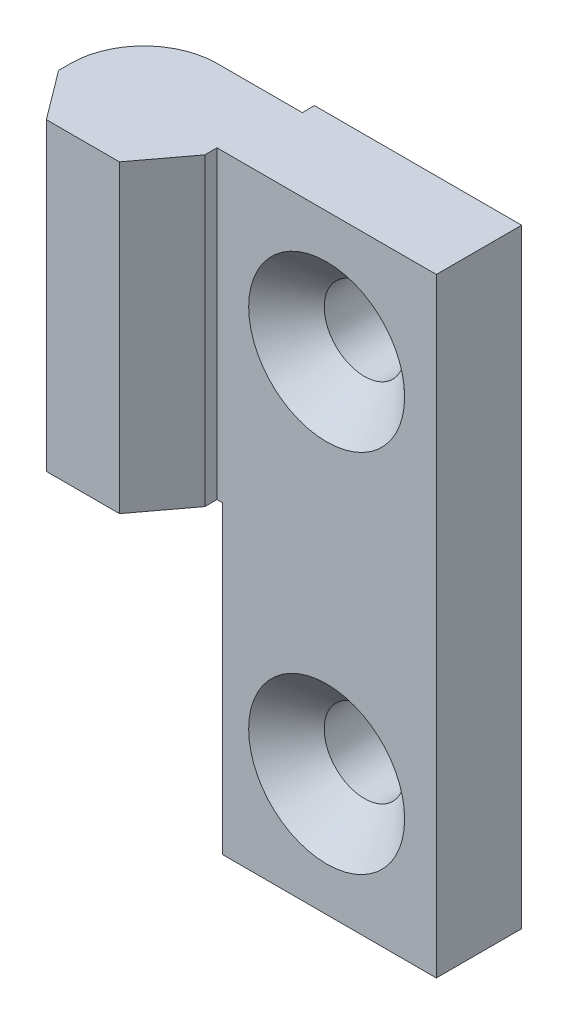
ISO-10303-21;
HEADER;
FILE_DESCRIPTION(('STEP AP214'),'2;1');
FILE_NAME('part.step','',(''),(''),'','','');
FILE_SCHEMA(('AUTOMOTIVE_DESIGN { 1 0 10303 214 1 1 1 1 }'));
ENDSEC;
DATA;
#1=APPLICATION_CONTEXT('core data for automotive mechanical design processes');
#2=APPLICATION_PROTOCOL_DEFINITION('international standard','automotive_design',2000,#1);
#3=PRODUCT_CONTEXT('',#1,'mechanical');
#4=PRODUCT('Part','Part','',(#3));
#5=PRODUCT_RELATED_PRODUCT_CATEGORY('part','',(#4));
#6=PRODUCT_DEFINITION_FORMATION('','',#4);
#7=PRODUCT_DEFINITION_CONTEXT('part definition',#1,'design');
#8=PRODUCT_DEFINITION('design','',#6,#7);
#9=PRODUCT_DEFINITION_SHAPE('','',#8);
#10=(LENGTH_UNIT() NAMED_UNIT(*) SI_UNIT(.MILLI.,.METRE.));
#11=(NAMED_UNIT(*) PLANE_ANGLE_UNIT() SI_UNIT($,.RADIAN.));
#12=(NAMED_UNIT(*) SI_UNIT($,.STERADIAN.) SOLID_ANGLE_UNIT());
#13=UNCERTAINTY_MEASURE_WITH_UNIT(LENGTH_MEASURE(1.E-05),#10,'distance_accuracy_value','');
#14=(GEOMETRIC_REPRESENTATION_CONTEXT(3) GLOBAL_UNCERTAINTY_ASSIGNED_CONTEXT((#13)) GLOBAL_UNIT_ASSIGNED_CONTEXT((#10,
#11,#12)) REPRESENTATION_CONTEXT('',''));
#15=CARTESIAN_POINT('',(0.,0.,0.));
#16=DIRECTION('',(0.,0.,1.));
#17=DIRECTION('',(1.,0.,0.));
#18=AXIS2_PLACEMENT_3D('',#15,#16,#17);
#19=CARTESIAN_POINT('',(-21.,50.,5.));
#20=DIRECTION('',(0.,0.,-1.));
#21=DIRECTION('',(-1.,0.,0.));
#22=AXIS2_PLACEMENT_3D('',#19,#20,#21);
#23=PLANE('',#22);
#24=DIRECTION('',(-1.,0.,0.));
#25=VECTOR('',#24,1.);
#26=CARTESIAN_POINT('',(-30.,25.,5.));
#27=LINE('',#26,#25);
#28=CARTESIAN_POINT('',(-21.,25.,5.));
#29=VERTEX_POINT('',#28);
#30=CARTESIAN_POINT('',(-27.,25.,5.));
#31=VERTEX_POINT('',#30);
#32=EDGE_CURVE('E259',#29,#31,#27,.T.);
#33=ORIENTED_EDGE('',*,*,#32,.F.);
#34=DIRECTION('',(0.,-1.,0.));
#35=VECTOR('',#34,1.);
#36=CARTESIAN_POINT('',(-21.,50.,5.));
#37=LINE('',#36,#35);
#38=CARTESIAN_POINT('',(-21.,50.,5.));
#39=VERTEX_POINT('',#38);
#40=EDGE_CURVE('E187',#39,#29,#37,.T.);
#41=ORIENTED_EDGE('',*,*,#40,.F.);
#42=DIRECTION('',(1.,0.,0.));
#43=VECTOR('',#42,1.);
#44=CARTESIAN_POINT('',(-21.,50.,5.));
#45=LINE('',#44,#43);
#46=CARTESIAN_POINT('',(-27.,50.,5.));
#47=VERTEX_POINT('',#46);
#48=EDGE_CURVE('E217',#47,#39,#45,.T.);
#49=ORIENTED_EDGE('',*,*,#48,.F.);
#50=DIRECTION('',(0.,-1.,0.));
#51=VECTOR('',#50,1.);
#52=CARTESIAN_POINT('',(-27.,50.,5.));
#53=LINE('',#52,#51);
#54=EDGE_CURVE('E169',#47,#31,#53,.T.);
#55=ORIENTED_EDGE('',*,*,#54,.T.);
#56=EDGE_LOOP('',(#33,#41,#49,#55));
#57=FACE_BOUND('',#56,.T.);
#58=ADVANCED_FACE('F39',(#57),#23,.F.);
#59=CARTESIAN_POINT('',(-30.,50.,1.));
#60=DIRECTION('',(1.,0.,0.));
#61=DIRECTION('',(0.,0.,-1.));
#62=AXIS2_PLACEMENT_3D('',#59,#60,#61);
#63=PLANE('',#62);
#64=DIRECTION('',(0.,0.,-1.));
#65=VECTOR('',#64,1.);
#66=CARTESIAN_POINT('',(-30.,25.,5.));
#67=LINE('',#66,#65);
#68=CARTESIAN_POINT('',(-30.,25.,1.));
#69=VERTEX_POINT('',#68);
#70=CARTESIAN_POINT('',(-30.,25.,0.));
#71=VERTEX_POINT('',#70);
#72=EDGE_CURVE('E56',#69,#71,#67,.T.);
#73=ORIENTED_EDGE('',*,*,#72,.F.);
#74=DIRECTION('',(0.,-1.,0.));
#75=VECTOR('',#74,1.);
#76=CARTESIAN_POINT('',(-30.,50.,1.));
#77=LINE('',#76,#75);
#78=CARTESIAN_POINT('',(-30.,50.,1.));
#79=VERTEX_POINT('',#78);
#80=EDGE_CURVE('E165',#79,#69,#77,.T.);
#81=ORIENTED_EDGE('',*,*,#80,.F.);
#82=DIRECTION('',(0.,0.,1.));
#83=VECTOR('',#82,1.);
#84=CARTESIAN_POINT('',(-30.,50.,1.));
#85=LINE('',#84,#83);
#86=CARTESIAN_POINT('',(-30.,50.,0.));
#87=VERTEX_POINT('',#86);
#88=EDGE_CURVE('E221',#87,#79,#85,.T.);
#89=ORIENTED_EDGE('',*,*,#88,.F.);
#90=DIRECTION('',(0.,-1.,0.));
#91=VECTOR('',#90,1.);
#92=CARTESIAN_POINT('',(-30.,50.,0.));
#93=LINE('',#92,#91);
#94=EDGE_CURVE('E179',#87,#71,#93,.T.);
#95=ORIENTED_EDGE('',*,*,#94,.T.);
#96=EDGE_LOOP('',(#73,#81,#89,#95));
#97=FACE_BOUND('',#96,.T.);
#98=ADVANCED_FACE('F321',(#97),#63,.F.);
#99=CARTESIAN_POINT('',(-30.,50.,-6.));
#100=DIRECTION('',(0.,0.,1.));
#101=DIRECTION('',(1.,0.,0.));
#102=AXIS2_PLACEMENT_3D('',#99,#100,#101);
#103=PLANE('',#102);
#104=DIRECTION('',(1.,0.,0.));
#105=VECTOR('',#104,1.);
#106=CARTESIAN_POINT('',(-30.,25.,-6.));
#107=LINE('',#106,#105);
#108=CARTESIAN_POINT('',(-24.,25.,-6.));
#109=VERTEX_POINT('',#108);
#110=CARTESIAN_POINT('',(-17.,25.,-6.));
#111=VERTEX_POINT('',#110);
#112=EDGE_CURVE('E132',#109,#111,#107,.T.);
#113=ORIENTED_EDGE('',*,*,#112,.F.);
#114=DIRECTION('',(0.,-1.,0.));
#115=VECTOR('',#114,1.);
#116=CARTESIAN_POINT('',(-24.,50.,-6.));
#117=LINE('',#116,#115);
#118=CARTESIAN_POINT('',(-24.,50.,-6.));
#119=VERTEX_POINT('',#118);
#120=EDGE_CURVE('E63',#109,#119,#117,.F.);
#121=ORIENTED_EDGE('',*,*,#120,.T.);
#122=DIRECTION('',(-1.,0.,0.));
#123=VECTOR('',#122,1.);
#124=CARTESIAN_POINT('',(-30.,50.,-6.));
#125=LINE('',#124,#123);
#126=CARTESIAN_POINT('',(-17.,50.,-6.));
#127=VERTEX_POINT('',#126);
#128=EDGE_CURVE('E163',#127,#119,#125,.T.);
#129=ORIENTED_EDGE('',*,*,#128,.F.);
#130=DIRECTION('',(0.,-1.,0.));
#131=VECTOR('',#130,1.);
#132=CARTESIAN_POINT('',(-17.,50.,-6.));
#133=LINE('',#132,#131);
#134=EDGE_CURVE('E155',#127,#111,#133,.T.);
#135=ORIENTED_EDGE('',*,*,#134,.T.);
#136=EDGE_LOOP('',(#113,#121,#129,#135));
#137=FACE_BOUND('',#136,.T.);
#138=ADVANCED_FACE('F162',(#137),#103,.F.);
#139=CARTESIAN_POINT('',(-27.,50.,5.));
#140=DIRECTION('',(0.8,0.,-0.6));
#141=DIRECTION('',(-0.6,0.,-0.8));
#142=AXIS2_PLACEMENT_3D('',#139,#140,#141);
#143=PLANE('',#142);
#144=DIRECTION('',(-0.6,0.,-0.8));
#145=VECTOR('',#144,1.);
#146=CARTESIAN_POINT('',(-27.,25.,5.));
#147=LINE('',#146,#145);
#148=EDGE_CURVE('E248',#31,#69,#147,.T.);
#149=ORIENTED_EDGE('',*,*,#148,.F.);
#150=ORIENTED_EDGE('',*,*,#54,.F.);
#151=DIRECTION('',(0.6,0.,0.8));
#152=VECTOR('',#151,1.);
#153=CARTESIAN_POINT('',(-27.,50.,5.));
#154=LINE('',#153,#152);
#155=EDGE_CURVE('E219',#79,#47,#154,.T.);
#156=ORIENTED_EDGE('',*,*,#155,.F.);
#157=ORIENTED_EDGE('',*,*,#80,.T.);
#158=EDGE_LOOP('',(#149,#150,#156,#157));
#159=FACE_BOUND('',#158,.T.);
#160=ADVANCED_FACE('F317',(#159),#143,.F.);
#161=CARTESIAN_POINT('',(-18.,50.,1.));
#162=DIRECTION('',(-0.8,0.,-0.6));
#163=DIRECTION('',(-0.6,0.,0.8));
#164=AXIS2_PLACEMENT_3D('',#161,#162,#163);
#165=PLANE('',#164);
#166=DIRECTION('',(-0.6,0.,0.8));
#167=VECTOR('',#166,1.);
#168=CARTESIAN_POINT('',(-18.,25.,1.));
#169=LINE('',#168,#167);
#170=CARTESIAN_POINT('',(-18.,25.,1.));
#171=VERTEX_POINT('',#170);
#172=EDGE_CURVE('E252',#171,#29,#169,.T.);
#173=ORIENTED_EDGE('',*,*,#172,.F.);
#174=DIRECTION('',(0.,-1.,0.));
#175=VECTOR('',#174,1.);
#176=CARTESIAN_POINT('',(-18.,50.,1.));
#177=LINE('',#176,#175);
#178=CARTESIAN_POINT('',(-18.,50.,1.));
#179=VERTEX_POINT('',#178);
#180=EDGE_CURVE('E190',#179,#171,#177,.T.);
#181=ORIENTED_EDGE('',*,*,#180,.F.);
#182=DIRECTION('',(0.6,0.,-0.8));
#183=VECTOR('',#182,1.);
#184=CARTESIAN_POINT('',(-18.,50.,1.));
#185=LINE('',#184,#183);
#186=EDGE_CURVE('E215',#39,#179,#185,.T.);
#187=ORIENTED_EDGE('',*,*,#186,.F.);
#188=ORIENTED_EDGE('',*,*,#40,.T.);
#189=EDGE_LOOP('',(#173,#181,#187,#188));
#190=FACE_BOUND('',#189,.T.);
#191=ADVANCED_FACE('F313',(#190),#165,.F.);
#192=CARTESIAN_POINT('',(-18.,50.,0.));
#193=DIRECTION('',(-1.,0.,0.));
#194=DIRECTION('',(0.,0.,1.));
#195=AXIS2_PLACEMENT_3D('',#192,#193,#194);
#196=PLANE('',#195);
#197=DIRECTION('',(0.,0.,1.));
#198=VECTOR('',#197,1.);
#199=CARTESIAN_POINT('',(-18.,25.,0.));
#200=LINE('',#199,#198);
#201=CARTESIAN_POINT('',(-18.,25.,0.));
#202=VERTEX_POINT('',#201);
#203=EDGE_CURVE('E256',#202,#171,#200,.T.);
#204=ORIENTED_EDGE('',*,*,#203,.F.);
#205=DIRECTION('',(0.,-1.,0.));
#206=VECTOR('',#205,1.);
#207=CARTESIAN_POINT('',(-18.,50.,0.));
#208=LINE('',#207,#206);
#209=CARTESIAN_POINT('',(-18.,50.,0.));
#210=VERTEX_POINT('',#209);
#211=EDGE_CURVE('E196',#210,#202,#208,.T.);
#212=ORIENTED_EDGE('',*,*,#211,.F.);
#213=DIRECTION('',(0.,0.,-1.));
#214=VECTOR('',#213,1.);
#215=CARTESIAN_POINT('',(-18.,50.,0.));
#216=LINE('',#215,#214);
#217=EDGE_CURVE('E213',#179,#210,#216,.T.);
#218=ORIENTED_EDGE('',*,*,#217,.F.);
#219=ORIENTED_EDGE('',*,*,#180,.T.);
#220=EDGE_LOOP('',(#204,#212,#218,#219));
#221=FACE_BOUND('',#220,.T.);
#222=ADVANCED_FACE('F309',(#221),#196,.F.);
#223=CARTESIAN_POINT('',(0.,50.,0.));
#224=DIRECTION('',(0.,0.,-1.));
#225=DIRECTION('',(-1.,0.,0.));
#226=AXIS2_PLACEMENT_3D('',#223,#224,#225);
#227=PLANE('',#226);
#228=CARTESIAN_POINT('',(-9.,10.,0.));
#229=DIRECTION('',(0.,0.,1.));
#230=DIRECTION('',(1.,0.,0.));
#231=AXIS2_PLACEMENT_3D('',#228,#229,#230);
#232=CIRCLE('',#231,6.4);
#233=CARTESIAN_POINT('',(-2.6,10.,0.));
#234=VERTEX_POINT('',#233);
#235=EDGE_CURVE('E235',#234,#234,#232,.T.);
#236=ORIENTED_EDGE('',*,*,#235,.F.);
#237=EDGE_LOOP('',(#236));
#238=FACE_BOUND('',#237,.T.);
#239=CARTESIAN_POINT('',(-9.,40.,0.));
#240=DIRECTION('',(0.,0.,1.));
#241=DIRECTION('',(1.,0.,0.));
#242=AXIS2_PLACEMENT_3D('',#239,#240,#241);
#243=CIRCLE('',#242,6.4);
#244=CARTESIAN_POINT('',(-2.6,40.,0.));
#245=VERTEX_POINT('',#244);
#246=EDGE_CURVE('E244',#245,#245,#243,.T.);
#247=ORIENTED_EDGE('',*,*,#246,.F.);
#248=EDGE_LOOP('',(#247));
#249=FACE_BOUND('',#248,.T.);
#250=DIRECTION('',(-1.,0.,0.));
#251=VECTOR('',#250,1.);
#252=CARTESIAN_POINT('',(0.,25.,0.));
#253=LINE('',#252,#251);
#254=CARTESIAN_POINT('',(-17.5454545454545,25.,0.));
#255=VERTEX_POINT('',#254);
#256=EDGE_CURVE('E258',#255,#202,#253,.T.);
#257=ORIENTED_EDGE('',*,*,#256,.F.);
#258=DIRECTION('',(0.,1.,0.));
#259=VECTOR('',#258,1.);
#260=CARTESIAN_POINT('',(-17.5454545454545,50.,0.));
#261=LINE('',#260,#259);
#262=CARTESIAN_POINT('',(-17.5454545454545,0.,0.));
#263=VERTEX_POINT('',#262);
#264=EDGE_CURVE('E147',#263,#255,#261,.T.);
#265=ORIENTED_EDGE('',*,*,#264,.F.);
#266=DIRECTION('',(1.,0.,0.));
#267=VECTOR('',#266,1.);
#268=CARTESIAN_POINT('',(0.,0.,0.));
#269=LINE('',#268,#267);
#270=CARTESIAN_POINT('',(0.,0.,0.));
#271=VERTEX_POINT('',#270);
#272=EDGE_CURVE('E203',#263,#271,#269,.T.);
#273=ORIENTED_EDGE('',*,*,#272,.T.);
#274=DIRECTION('',(0.,-1.,0.));
#275=VECTOR('',#274,1.);
#276=CARTESIAN_POINT('',(0.,50.,0.));
#277=LINE('',#276,#275);
#278=CARTESIAN_POINT('',(0.,50.,0.));
#279=VERTEX_POINT('',#278);
#280=EDGE_CURVE('E199',#279,#271,#277,.T.);
#281=ORIENTED_EDGE('',*,*,#280,.F.);
#282=DIRECTION('',(1.,0.,0.));
#283=VECTOR('',#282,1.);
#284=CARTESIAN_POINT('',(0.,50.,0.));
#285=LINE('',#284,#283);
#286=EDGE_CURVE('E202',#210,#279,#285,.T.);
#287=ORIENTED_EDGE('',*,*,#286,.F.);
#288=ORIENTED_EDGE('',*,*,#211,.T.);
#289=EDGE_LOOP('',(#257,#265,#273,#281,#287,#288));
#290=FACE_BOUND('',#289,.T.);
#291=ADVANCED_FACE('F305',(#238,#249,#290),#227,.F.);
#292=CARTESIAN_POINT('',(0.,0.,0.));
#293=DIRECTION('',(0.,-1.,0.));
#294=DIRECTION('',(0.,0.,-1.));
#295=AXIS2_PLACEMENT_3D('',#292,#293,#294);
#296=PLANE('',#295);
#297=ORIENTED_EDGE('',*,*,#272,.F.);
#298=DIRECTION('',(0.0905357460425183,0.,-0.995893206467704));
#299=VECTOR('',#298,1.);
#300=CARTESIAN_POINT('',(-18.,0.,5.));
#301=LINE('',#300,#299);
#302=CARTESIAN_POINT('',(-17.,0.,-6.));
#303=VERTEX_POINT('',#302);
#304=EDGE_CURVE('E138',#263,#303,#301,.T.);
#305=ORIENTED_EDGE('',*,*,#304,.T.);
#306=DIRECTION('',(0.,0.,1.));
#307=VECTOR('',#306,1.);
#308=CARTESIAN_POINT('',(-17.,0.,-6.));
#309=LINE('',#308,#307);
#310=CARTESIAN_POINT('',(-17.,0.,-7.));
#311=VERTEX_POINT('',#310);
#312=EDGE_CURVE('E158',#311,#303,#309,.T.);
#313=ORIENTED_EDGE('',*,*,#312,.F.);
#314=DIRECTION('',(-1.,0.,0.));
#315=VECTOR('',#314,1.);
#316=CARTESIAN_POINT('',(-17.,0.,-7.));
#317=LINE('',#316,#315);
#318=CARTESIAN_POINT('',(0.,0.,-7.));
#319=VERTEX_POINT('',#318);
#320=EDGE_CURVE('E206',#319,#311,#317,.T.);
#321=ORIENTED_EDGE('',*,*,#320,.F.);
#322=DIRECTION('',(0.,0.,-1.));
#323=VECTOR('',#322,1.);
#324=CARTESIAN_POINT('',(0.,0.,-7.));
#325=LINE('',#324,#323);
#326=EDGE_CURVE('E208',#271,#319,#325,.T.);
#327=ORIENTED_EDGE('',*,*,#326,.F.);
#328=EDGE_LOOP('',(#297,#305,#313,#321,#327));
#329=FACE_BOUND('',#328,.T.);
#330=ADVANCED_FACE('F302',(#329),#296,.T.);
#331=CARTESIAN_POINT('',(-24.,50.,0.));
#332=DIRECTION('',(0.,-1.,0.));
#333=DIRECTION('',(0.,0.,-1.));
#334=AXIS2_PLACEMENT_3D('',#331,#332,#333);
#335=CYLINDRICAL_SURFACE('',#334,6.);
#336=ORIENTED_EDGE('',*,*,#120,.F.);
#337=CARTESIAN_POINT('',(-24.,25.,0.));
#338=DIRECTION('',(0.,-1.,0.));
#339=DIRECTION('',(0.,0.,-1.));
#340=AXIS2_PLACEMENT_3D('',#337,#338,#339);
#341=CIRCLE('',#340,6.);
#342=EDGE_CURVE('E12',#109,#71,#341,.F.);
#343=ORIENTED_EDGE('',*,*,#342,.T.);
#344=ORIENTED_EDGE('',*,*,#94,.F.);
#345=CARTESIAN_POINT('',(-24.,50.,0.));
#346=DIRECTION('',(0.,-1.,0.));
#347=DIRECTION('',(0.,0.,-1.));
#348=AXIS2_PLACEMENT_3D('',#345,#346,#347);
#349=CIRCLE('',#348,6.);
#350=EDGE_CURVE('E48',#119,#87,#349,.F.);
#351=ORIENTED_EDGE('',*,*,#350,.F.);
#352=EDGE_LOOP('',(#336,#343,#344,#351));
#353=FACE_BOUND('',#352,.T.);
#354=ADVANCED_FACE('F41',(#353),#335,.T.);
#355=CARTESIAN_POINT('',(0.,50.,-7.));
#356=DIRECTION('',(-1.,0.,0.));
#357=DIRECTION('',(0.,0.,1.));
#358=AXIS2_PLACEMENT_3D('',#355,#356,#357);
#359=PLANE('',#358);
#360=ORIENTED_EDGE('',*,*,#326,.T.);
#361=DIRECTION('',(0.,-1.,0.));
#362=VECTOR('',#361,1.);
#363=CARTESIAN_POINT('',(0.,50.,-7.));
#364=LINE('',#363,#362);
#365=CARTESIAN_POINT('',(0.,50.,-7.));
#366=VERTEX_POINT('',#365);
#367=EDGE_CURVE('E166',#366,#319,#364,.T.);
#368=ORIENTED_EDGE('',*,*,#367,.F.);
#369=DIRECTION('',(0.,0.,-1.));
#370=VECTOR('',#369,1.);
#371=CARTESIAN_POINT('',(0.,50.,-7.));
#372=LINE('',#371,#370);
#373=EDGE_CURVE('E205',#279,#366,#372,.T.);
#374=ORIENTED_EDGE('',*,*,#373,.F.);
#375=ORIENTED_EDGE('',*,*,#280,.T.);
#376=EDGE_LOOP('',(#360,#368,#374,#375));
#377=FACE_BOUND('',#376,.T.);
#378=ADVANCED_FACE('F363',(#377),#359,.F.);
#379=CARTESIAN_POINT('',(-17.,50.,-7.));
#380=DIRECTION('',(0.,0.,1.));
#381=DIRECTION('',(1.,0.,0.));
#382=AXIS2_PLACEMENT_3D('',#379,#380,#381);
#383=PLANE('',#382);
#384=CARTESIAN_POINT('',(-9.,40.,-7.));
#385=DIRECTION('',(0.,0.,1.));
#386=DIRECTION('',(1.,0.,0.));
#387=AXIS2_PLACEMENT_3D('',#384,#385,#386);
#388=CIRCLE('',#387,3.3);
#389=CARTESIAN_POINT('',(-5.7,40.,-7.));
#390=VERTEX_POINT('',#389);
#391=EDGE_CURVE('E238',#390,#390,#388,.T.);
#392=ORIENTED_EDGE('',*,*,#391,.T.);
#393=EDGE_LOOP('',(#392));
#394=FACE_BOUND('',#393,.T.);
#395=CARTESIAN_POINT('',(-9.,10.,-7.));
#396=DIRECTION('',(0.,0.,1.));
#397=DIRECTION('',(1.,0.,0.));
#398=AXIS2_PLACEMENT_3D('',#395,#396,#397);
#399=CIRCLE('',#398,3.3);
#400=CARTESIAN_POINT('',(-5.7,10.,-7.));
#401=VERTEX_POINT('',#400);
#402=EDGE_CURVE('E211',#401,#401,#399,.T.);
#403=ORIENTED_EDGE('',*,*,#402,.T.);
#404=EDGE_LOOP('',(#403));
#405=FACE_BOUND('',#404,.T.);
#406=ORIENTED_EDGE('',*,*,#320,.T.);
#407=DIRECTION('',(0.,-1.,0.));
#408=VECTOR('',#407,1.);
#409=CARTESIAN_POINT('',(-17.,50.,-7.));
#410=LINE('',#409,#408);
#411=CARTESIAN_POINT('',(-17.,50.,-7.));
#412=VERTEX_POINT('',#411);
#413=EDGE_CURVE('E164',#412,#311,#410,.T.);
#414=ORIENTED_EDGE('',*,*,#413,.F.);
#415=DIRECTION('',(-1.,0.,0.));
#416=VECTOR('',#415,1.);
#417=CARTESIAN_POINT('',(-17.,50.,-7.));
#418=LINE('',#417,#416);
#419=EDGE_CURVE('E226',#366,#412,#418,.T.);
#420=ORIENTED_EDGE('',*,*,#419,.F.);
#421=ORIENTED_EDGE('',*,*,#367,.T.);
#422=EDGE_LOOP('',(#406,#414,#420,#421));
#423=FACE_BOUND('',#422,.T.);
#424=ADVANCED_FACE('F334',(#394,#405,#423),#383,.F.);
#425=CARTESIAN_POINT('',(-17.,50.,-6.));
#426=DIRECTION('',(1.,0.,0.));
#427=DIRECTION('',(0.,0.,-1.));
#428=AXIS2_PLACEMENT_3D('',#425,#426,#427);
#429=PLANE('',#428);
#430=ORIENTED_EDGE('',*,*,#312,.T.);
#431=DIRECTION('',(0.,-1.,0.));
#432=VECTOR('',#431,1.);
#433=CARTESIAN_POINT('',(-17.,25.,-6.));
#434=LINE('',#433,#432);
#435=EDGE_CURVE('E139',#111,#303,#434,.T.);
#436=ORIENTED_EDGE('',*,*,#435,.F.);
#437=ORIENTED_EDGE('',*,*,#134,.F.);
#438=DIRECTION('',(0.,0.,1.));
#439=VECTOR('',#438,1.);
#440=CARTESIAN_POINT('',(-17.,50.,-6.));
#441=LINE('',#440,#439);
#442=EDGE_CURVE('E224',#412,#127,#441,.T.);
#443=ORIENTED_EDGE('',*,*,#442,.F.);
#444=ORIENTED_EDGE('',*,*,#413,.T.);
#445=EDGE_LOOP('',(#430,#436,#437,#443,#444));
#446=FACE_BOUND('',#445,.T.);
#447=ADVANCED_FACE('F153',(#446),#429,.F.);
#448=CARTESIAN_POINT('',(0.,50.,0.));
#449=DIRECTION('',(0.,-1.,0.));
#450=DIRECTION('',(0.,0.,-1.));
#451=AXIS2_PLACEMENT_3D('',#448,#449,#450);
#452=PLANE('',#451);
#453=ORIENTED_EDGE('',*,*,#128,.T.);
#454=ORIENTED_EDGE('',*,*,#350,.T.);
#455=ORIENTED_EDGE('',*,*,#88,.T.);
#456=ORIENTED_EDGE('',*,*,#155,.T.);
#457=ORIENTED_EDGE('',*,*,#48,.T.);
#458=ORIENTED_EDGE('',*,*,#186,.T.);
#459=ORIENTED_EDGE('',*,*,#217,.T.);
#460=ORIENTED_EDGE('',*,*,#286,.T.);
#461=ORIENTED_EDGE('',*,*,#373,.T.);
#462=ORIENTED_EDGE('',*,*,#419,.T.);
#463=ORIENTED_EDGE('',*,*,#442,.T.);
#464=EDGE_LOOP('',(#453,#454,#455,#456,#457,#458,#459,#460,#461,#462,#463));
#465=FACE_BOUND('',#464,.T.);
#466=ADVANCED_FACE('F297',(#465),#452,.F.);
#467=CARTESIAN_POINT('',(-9.,10.,0.));
#468=DIRECTION('',(0.,0.,1.));
#469=DIRECTION('',(1.,0.,0.));
#470=AXIS2_PLACEMENT_3D('',#467,#468,#469);
#471=CYLINDRICAL_SURFACE('',#470,3.3);
#472=ORIENTED_EDGE('',*,*,#402,.F.);
#473=EDGE_LOOP('',(#472));
#474=FACE_BOUND('',#473,.T.);
#475=CARTESIAN_POINT('',(-9.,10.,-3.1));
#476=DIRECTION('',(0.,0.,1.));
#477=DIRECTION('',(1.,0.,0.));
#478=AXIS2_PLACEMENT_3D('',#475,#476,#477);
#479=CIRCLE('',#478,3.3);
#480=CARTESIAN_POINT('',(-5.7,10.,-3.1));
#481=VERTEX_POINT('',#480);
#482=EDGE_CURVE('E232',#481,#481,#479,.T.);
#483=ORIENTED_EDGE('',*,*,#482,.T.);
#484=EDGE_LOOP('',(#483));
#485=FACE_BOUND('',#484,.T.);
#486=ADVANCED_FACE('F293',(#474,#485),#471,.F.);
#487=CARTESIAN_POINT('',(-9.,10.,0.));
#488=DIRECTION('',(0.,0.,1.));
#489=DIRECTION('',(1.,0.,0.));
#490=AXIS2_PLACEMENT_3D('',#487,#488,#489);
#491=CONICAL_SURFACE('',#490,6.4,0.785398163397449);
#492=ORIENTED_EDGE('',*,*,#482,.F.);
#493=EDGE_LOOP('',(#492));
#494=FACE_BOUND('',#493,.T.);
#495=ORIENTED_EDGE('',*,*,#235,.T.);
#496=EDGE_LOOP('',(#495));
#497=FACE_BOUND('',#496,.T.);
#498=ADVANCED_FACE('F289',(#494,#497),#491,.F.);
#499=CARTESIAN_POINT('',(-9.,40.,0.));
#500=DIRECTION('',(0.,0.,1.));
#501=DIRECTION('',(1.,0.,0.));
#502=AXIS2_PLACEMENT_3D('',#499,#500,#501);
#503=CYLINDRICAL_SURFACE('',#502,3.3);
#504=ORIENTED_EDGE('',*,*,#391,.F.);
#505=EDGE_LOOP('',(#504));
#506=FACE_BOUND('',#505,.T.);
#507=CARTESIAN_POINT('',(-9.,40.,-3.1));
#508=DIRECTION('',(0.,0.,1.));
#509=DIRECTION('',(1.,0.,0.));
#510=AXIS2_PLACEMENT_3D('',#507,#508,#509);
#511=CIRCLE('',#510,3.3);
#512=CARTESIAN_POINT('',(-5.7,40.,-3.1));
#513=VERTEX_POINT('',#512);
#514=EDGE_CURVE('E241',#513,#513,#511,.T.);
#515=ORIENTED_EDGE('',*,*,#514,.T.);
#516=EDGE_LOOP('',(#515));
#517=FACE_BOUND('',#516,.T.);
#518=ADVANCED_FACE('F285',(#506,#517),#503,.F.);
#519=CARTESIAN_POINT('',(-9.,40.,0.));
#520=DIRECTION('',(0.,0.,1.));
#521=DIRECTION('',(1.,0.,0.));
#522=AXIS2_PLACEMENT_3D('',#519,#520,#521);
#523=CONICAL_SURFACE('',#522,6.4,0.785398163397449);
#524=ORIENTED_EDGE('',*,*,#514,.F.);
#525=EDGE_LOOP('',(#524));
#526=FACE_BOUND('',#525,.T.);
#527=ORIENTED_EDGE('',*,*,#246,.T.);
#528=EDGE_LOOP('',(#527));
#529=FACE_BOUND('',#528,.T.);
#530=ADVANCED_FACE('F282',(#526,#529),#523,.F.);
#531=CARTESIAN_POINT('',(-17.,0.,-6.));
#532=DIRECTION('',(-0.995893206467704,0.,-0.0905357460425183));
#533=DIRECTION('',(-0.0905357460425183,0.,0.995893206467704));
#534=AXIS2_PLACEMENT_3D('',#531,#532,#533);
#535=PLANE('',#534);
#536=ORIENTED_EDGE('',*,*,#264,.T.);
#537=DIRECTION('',(0.0905357460425189,0.,-0.995893206467704));
#538=VECTOR('',#537,1.);
#539=CARTESIAN_POINT('',(-18.,25.,5.));
#540=LINE('',#539,#538);
#541=EDGE_CURVE('E135',#255,#111,#540,.T.);
#542=ORIENTED_EDGE('',*,*,#541,.T.);
#543=ORIENTED_EDGE('',*,*,#435,.T.);
#544=ORIENTED_EDGE('',*,*,#304,.F.);
#545=EDGE_LOOP('',(#536,#542,#543,#544));
#546=FACE_BOUND('',#545,.T.);
#547=ADVANCED_FACE('F143',(#546),#535,.T.);
#548=CARTESIAN_POINT('',(-17.,25.,-6.));
#549=DIRECTION('',(0.,-1.,0.));
#550=DIRECTION('',(0.,0.,-1.));
#551=AXIS2_PLACEMENT_3D('',#548,#549,#550);
#552=PLANE('',#551);
#553=ORIENTED_EDGE('',*,*,#148,.T.);
#554=ORIENTED_EDGE('',*,*,#72,.T.);
#555=ORIENTED_EDGE('',*,*,#342,.F.);
#556=ORIENTED_EDGE('',*,*,#112,.T.);
#557=ORIENTED_EDGE('',*,*,#541,.F.);
#558=ORIENTED_EDGE('',*,*,#256,.T.);
#559=ORIENTED_EDGE('',*,*,#203,.T.);
#560=ORIENTED_EDGE('',*,*,#172,.T.);
#561=ORIENTED_EDGE('',*,*,#32,.T.);
#562=EDGE_LOOP('',(#553,#554,#555,#556,#557,#558,#559,#560,#561));
#563=FACE_BOUND('',#562,.T.);
#564=ADVANCED_FACE('F134',(#563),#552,.T.);
#565=CLOSED_SHELL('',(#58,#98,#138,#160,#191,#222,#291,#330,#354,#378,#424,#447,#466,#486,#498,
#518,#530,#547,#564));
#566=MANIFOLD_SOLID_BREP('B2',#565);
#567=ADVANCED_BREP_SHAPE_REPRESENTATION('',(#18,#566),#14);
#568=SHAPE_DEFINITION_REPRESENTATION(#9,#567);
ENDSEC;
END-ISO-10303-21;
